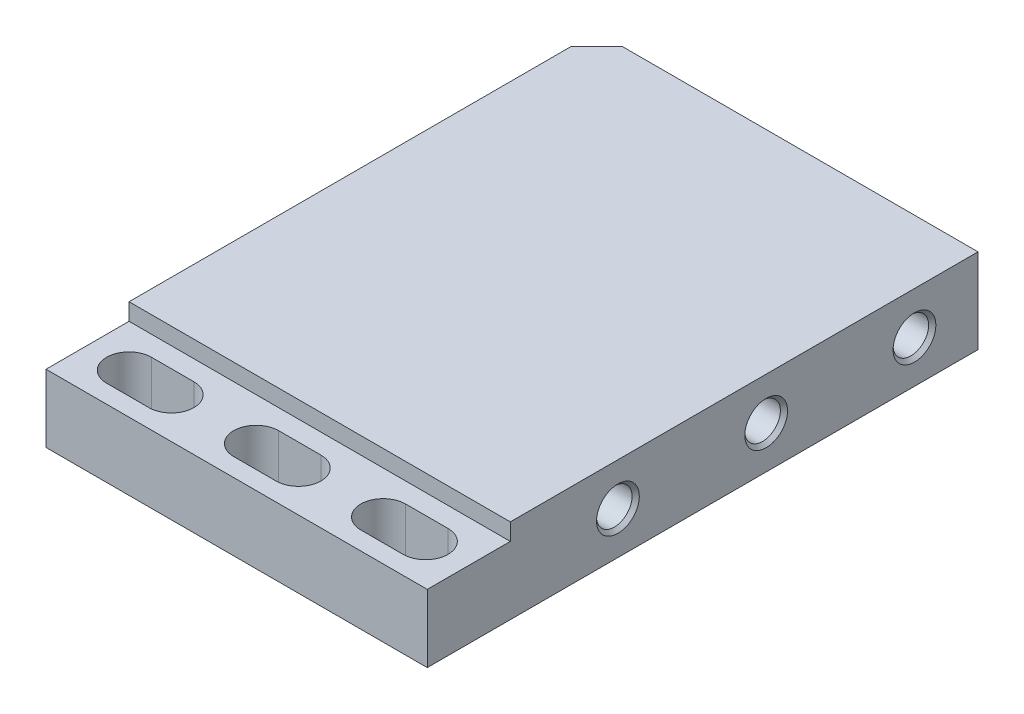
ISO-10303-21;
HEADER;
FILE_DESCRIPTION(('STEP AP214'),'2;1');
FILE_NAME('part.step','',(''),(''),'','','');
FILE_SCHEMA(('AUTOMOTIVE_DESIGN { 1 0 10303 214 1 1 1 1 }'));
ENDSEC;
DATA;
#1=APPLICATION_CONTEXT('core data for automotive mechanical design processes');
#2=APPLICATION_PROTOCOL_DEFINITION('international standard','automotive_design',2000,#1);
#3=PRODUCT_CONTEXT('',#1,'mechanical');
#4=PRODUCT('Part','Part','',(#3));
#5=PRODUCT_RELATED_PRODUCT_CATEGORY('part','',(#4));
#6=PRODUCT_DEFINITION_FORMATION('','',#4);
#7=PRODUCT_DEFINITION_CONTEXT('part definition',#1,'design');
#8=PRODUCT_DEFINITION('design','',#6,#7);
#9=PRODUCT_DEFINITION_SHAPE('','',#8);
#10=(LENGTH_UNIT() NAMED_UNIT(*) SI_UNIT(.MILLI.,.METRE.));
#11=(NAMED_UNIT(*) PLANE_ANGLE_UNIT() SI_UNIT($,.RADIAN.));
#12=(NAMED_UNIT(*) SI_UNIT($,.STERADIAN.) SOLID_ANGLE_UNIT());
#13=UNCERTAINTY_MEASURE_WITH_UNIT(LENGTH_MEASURE(1.E-05),#10,'distance_accuracy_value','');
#14=(GEOMETRIC_REPRESENTATION_CONTEXT(3) GLOBAL_UNCERTAINTY_ASSIGNED_CONTEXT((#13)) GLOBAL_UNIT_ASSIGNED_CONTEXT((#10,
#11,#12)) REPRESENTATION_CONTEXT('',''));
#15=CARTESIAN_POINT('',(0.,0.,0.));
#16=DIRECTION('',(0.,0.,1.));
#17=DIRECTION('',(1.,0.,0.));
#18=AXIS2_PLACEMENT_3D('',#15,#16,#17);
#19=CARTESIAN_POINT('',(-22.5,5.,-29.5));
#20=DIRECTION('',(0.707106781186545,0.,0.70710678118655));
#21=DIRECTION('',(0.,-1.,0.));
#22=AXIS2_PLACEMENT_3D('',#19,#20,#21);
#23=PLANE('',#22);
#24=DIRECTION('',(-0.70710678118655,0.,0.707106781186545));
#25=VECTOR('',#24,1.);
#26=CARTESIAN_POINT('',(-26.,5.,-26.));
#27=LINE('',#26,#25);
#28=CARTESIAN_POINT('',(-19.5,5.,-32.5));
#29=VERTEX_POINT('',#28);
#30=CARTESIAN_POINT('',(-22.5,5.,-29.5));
#31=VERTEX_POINT('',#30);
#32=EDGE_CURVE('E451',#29,#31,#27,.T.);
#33=ORIENTED_EDGE('',*,*,#32,.F.);
#34=DIRECTION('',(0.,1.,0.));
#35=VECTOR('',#34,1.);
#36=CARTESIAN_POINT('',(-19.5,5.,-32.5));
#37=LINE('',#36,#35);
#38=CARTESIAN_POINT('',(-19.5,-5.,-32.5));
#39=VERTEX_POINT('',#38);
#40=EDGE_CURVE('E446',#39,#29,#37,.T.);
#41=ORIENTED_EDGE('',*,*,#40,.F.);
#42=DIRECTION('',(0.70710678118655,0.,-0.707106781186545));
#43=VECTOR('',#42,1.);
#44=CARTESIAN_POINT('',(-22.5,-5.,-29.5));
#45=LINE('',#44,#43);
#46=CARTESIAN_POINT('',(-22.5,-5.,-29.5));
#47=VERTEX_POINT('',#46);
#48=EDGE_CURVE('E457',#47,#39,#45,.T.);
#49=ORIENTED_EDGE('',*,*,#48,.F.);
#50=DIRECTION('',(0.,-1.,0.));
#51=VECTOR('',#50,1.);
#52=CARTESIAN_POINT('',(-22.5,5.,-29.5));
#53=LINE('',#52,#51);
#54=EDGE_CURVE('E634',#31,#47,#53,.T.);
#55=ORIENTED_EDGE('',*,*,#54,.F.);
#56=EDGE_LOOP('',(#33,#41,#49,#55));
#57=FACE_BOUND('',#56,.T.);
#58=ADVANCED_FACE('F17',(#57),#23,.F.);
#59=CARTESIAN_POINT('',(0.,-5.,31.35));
#60=DIRECTION('',(0.,0.707106781186548,0.707106781186548));
#61=DIRECTION('',(1.,0.,0.));
#62=AXIS2_PLACEMENT_3D('',#59,#60,#61);
#63=PLANE('',#62);
#64=DIRECTION('',(0.,0.707106781186551,-0.707106781186545));
#65=VECTOR('',#64,1.);
#66=CARTESIAN_POINT('',(12.5,-5.,31.35));
#67=LINE('',#66,#65);
#68=CARTESIAN_POINT('',(12.5,-5.,31.35));
#69=VERTEX_POINT('',#68);
#70=CARTESIAN_POINT('',(12.5,-4.,30.35));
#71=VERTEX_POINT('',#70);
#72=EDGE_CURVE('E20',#69,#71,#67,.T.);
#73=ORIENTED_EDGE('',*,*,#72,.T.);
#74=DIRECTION('',(-1.,0.,0.));
#75=VECTOR('',#74,1.);
#76=CARTESIAN_POINT('',(17.5,-4.,30.35));
#77=LINE('',#76,#75);
#78=CARTESIAN_POINT('',(17.5,-4.,30.35));
#79=VERTEX_POINT('',#78);
#80=EDGE_CURVE('E339',#79,#71,#77,.T.);
#81=ORIENTED_EDGE('',*,*,#80,.F.);
#82=DIRECTION('',(0.,-0.707106781186549,0.707106781186546));
#83=VECTOR('',#82,1.);
#84=CARTESIAN_POINT('',(17.5,-4.,30.35));
#85=LINE('',#84,#83);
#86=CARTESIAN_POINT('',(17.5,-5.,31.35));
#87=VERTEX_POINT('',#86);
#88=EDGE_CURVE('E11',#79,#87,#85,.T.);
#89=ORIENTED_EDGE('',*,*,#88,.T.);
#90=DIRECTION('',(1.,0.,0.));
#91=VECTOR('',#90,1.);
#92=CARTESIAN_POINT('',(0.,-5.,31.35));
#93=LINE('',#92,#91);
#94=EDGE_CURVE('E507',#69,#87,#93,.T.);
#95=ORIENTED_EDGE('',*,*,#94,.F.);
#96=EDGE_LOOP('',(#73,#81,#89,#95));
#97=FACE_BOUND('',#96,.T.);
#98=ADVANCED_FACE('F1162',(#97),#63,.F.);
#99=CARTESIAN_POINT('',(17.5,-5.,27.7));
#100=DIRECTION('',(0.,-1.,0.));
#101=DIRECTION('',(0.,0.,-1.));
#102=AXIS2_PLACEMENT_3D('',#99,#100,#101);
#103=CONICAL_SURFACE('',#102,3.65,0.785398163397446);
#104=DIRECTION('',(0.,-0.707106781186549,-0.707106781186546));
#105=VECTOR('',#104,1.);
#106=CARTESIAN_POINT('',(17.5,-4.,25.05));
#107=LINE('',#106,#105);
#108=CARTESIAN_POINT('',(17.5,-4.,25.05));
#109=VERTEX_POINT('',#108);
#110=CARTESIAN_POINT('',(17.5,-5.,24.05));
#111=VERTEX_POINT('',#110);
#112=EDGE_CURVE('E432',#109,#111,#107,.T.);
#113=ORIENTED_EDGE('',*,*,#112,.T.);
#114=CARTESIAN_POINT('',(17.5,-5.,27.7));
#115=DIRECTION('',(0.,1.,0.));
#116=DIRECTION('',(0.,0.,1.));
#117=AXIS2_PLACEMENT_3D('',#114,#115,#116);
#118=CIRCLE('',#117,3.65);
#119=EDGE_CURVE('E511',#87,#111,#118,.T.);
#120=ORIENTED_EDGE('',*,*,#119,.F.);
#121=ORIENTED_EDGE('',*,*,#88,.F.);
#122=CARTESIAN_POINT('',(17.5,-4.,27.7));
#123=DIRECTION('',(0.,-1.,0.));
#124=DIRECTION('',(0.,0.,1.));
#125=AXIS2_PLACEMENT_3D('',#122,#123,#124);
#126=CIRCLE('',#125,2.65);
#127=EDGE_CURVE('E350',#109,#79,#126,.T.);
#128=ORIENTED_EDGE('',*,*,#127,.F.);
#129=EDGE_LOOP('',(#113,#120,#121,#128));
#130=FACE_BOUND('',#129,.T.);
#131=ADVANCED_FACE('F1158',(#130),#103,.F.);
#132=CARTESIAN_POINT('',(12.5,-5.,27.7));
#133=DIRECTION('',(0.,-1.,0.));
#134=DIRECTION('',(0.,0.,-1.));
#135=AXIS2_PLACEMENT_3D('',#132,#133,#134);
#136=CONICAL_SURFACE('',#135,3.65,0.785398163397446);
#137=DIRECTION('',(0.,0.707106781186549,0.707106781186546));
#138=VECTOR('',#137,1.);
#139=CARTESIAN_POINT('',(12.5,-5.,24.05));
#140=LINE('',#139,#138);
#141=CARTESIAN_POINT('',(12.5,-5.,24.05));
#142=VERTEX_POINT('',#141);
#143=CARTESIAN_POINT('',(12.5,-4.,25.05));
#144=VERTEX_POINT('',#143);
#145=EDGE_CURVE('E542',#142,#144,#140,.T.);
#146=ORIENTED_EDGE('',*,*,#145,.T.);
#147=CARTESIAN_POINT('',(12.5,-4.,27.7));
#148=DIRECTION('',(0.,-1.,0.));
#149=DIRECTION('',(0.,0.,1.));
#150=AXIS2_PLACEMENT_3D('',#147,#148,#149);
#151=CIRCLE('',#150,2.65);
#152=EDGE_CURVE('E338',#71,#144,#151,.T.);
#153=ORIENTED_EDGE('',*,*,#152,.F.);
#154=ORIENTED_EDGE('',*,*,#72,.F.);
#155=CARTESIAN_POINT('',(12.5,-5.,27.7));
#156=DIRECTION('',(0.,1.,0.));
#157=DIRECTION('',(0.,0.,1.));
#158=AXIS2_PLACEMENT_3D('',#155,#156,#157);
#159=CIRCLE('',#158,3.65);
#160=EDGE_CURVE('E503',#142,#69,#159,.T.);
#161=ORIENTED_EDGE('',*,*,#160,.F.);
#162=EDGE_LOOP('',(#146,#153,#154,#161));
#163=FACE_BOUND('',#162,.T.);
#164=ADVANCED_FACE('F1059',(#163),#136,.F.);
#165=CARTESIAN_POINT('',(0.,-5.,24.05));
#166=DIRECTION('',(0.,0.707106781186546,-0.707106781186549));
#167=DIRECTION('',(-1.,0.,0.));
#168=AXIS2_PLACEMENT_3D('',#165,#166,#167);
#169=PLANE('',#168);
#170=ORIENTED_EDGE('',*,*,#112,.F.);
#171=DIRECTION('',(1.,0.,0.));
#172=VECTOR('',#171,1.);
#173=CARTESIAN_POINT('',(17.5,-4.,25.05));
#174=LINE('',#173,#172);
#175=EDGE_CURVE('E374',#144,#109,#174,.T.);
#176=ORIENTED_EDGE('',*,*,#175,.F.);
#177=ORIENTED_EDGE('',*,*,#145,.F.);
#178=DIRECTION('',(-1.,0.,0.));
#179=VECTOR('',#178,1.);
#180=CARTESIAN_POINT('',(0.,-5.,24.05));
#181=LINE('',#180,#179);
#182=EDGE_CURVE('E515',#111,#142,#181,.T.);
#183=ORIENTED_EDGE('',*,*,#182,.F.);
#184=EDGE_LOOP('',(#170,#176,#177,#183));
#185=FACE_BOUND('',#184,.T.);
#186=ADVANCED_FACE('F1054',(#185),#169,.F.);
#187=CARTESIAN_POINT('',(0.,-5.,31.35));
#188=DIRECTION('',(0.,0.707106781186546,0.707106781186549));
#189=DIRECTION('',(1.,0.,0.));
#190=AXIS2_PLACEMENT_3D('',#187,#188,#189);
#191=PLANE('',#190);
#192=DIRECTION('',(0.,0.707106781186549,-0.707106781186546));
#193=VECTOR('',#192,1.);
#194=CARTESIAN_POINT('',(-2.5,-5.,31.35));
#195=LINE('',#194,#193);
#196=CARTESIAN_POINT('',(-2.5,-5.,31.35));
#197=VERTEX_POINT('',#196);
#198=CARTESIAN_POINT('',(-2.5,-4.,30.35));
#199=VERTEX_POINT('',#198);
#200=EDGE_CURVE('E416',#197,#199,#195,.T.);
#201=ORIENTED_EDGE('',*,*,#200,.T.);
#202=DIRECTION('',(-1.,0.,0.));
#203=VECTOR('',#202,1.);
#204=CARTESIAN_POINT('',(2.5,-4.,30.35));
#205=LINE('',#204,#203);
#206=CARTESIAN_POINT('',(2.5,-4.,30.35));
#207=VERTEX_POINT('',#206);
#208=EDGE_CURVE('E388',#207,#199,#205,.T.);
#209=ORIENTED_EDGE('',*,*,#208,.F.);
#210=DIRECTION('',(0.,-0.707106781186549,0.707106781186546));
#211=VECTOR('',#210,1.);
#212=CARTESIAN_POINT('',(2.5,-4.,30.35));
#213=LINE('',#212,#211);
#214=CARTESIAN_POINT('',(2.5,-5.,31.35));
#215=VERTEX_POINT('',#214);
#216=EDGE_CURVE('E424',#207,#215,#213,.T.);
#217=ORIENTED_EDGE('',*,*,#216,.T.);
#218=DIRECTION('',(1.,0.,0.));
#219=VECTOR('',#218,1.);
#220=CARTESIAN_POINT('',(0.,-5.,31.35));
#221=LINE('',#220,#219);
#222=EDGE_CURVE('E487',#197,#215,#221,.T.);
#223=ORIENTED_EDGE('',*,*,#222,.F.);
#224=EDGE_LOOP('',(#201,#209,#217,#223));
#225=FACE_BOUND('',#224,.T.);
#226=ADVANCED_FACE('F1058',(#225),#191,.F.);
#227=CARTESIAN_POINT('',(2.5,-5.,27.7));
#228=DIRECTION('',(0.,-1.,0.));
#229=DIRECTION('',(0.,0.,-1.));
#230=AXIS2_PLACEMENT_3D('',#227,#228,#229);
#231=CONICAL_SURFACE('',#230,3.65,0.785398163397446);
#232=DIRECTION('',(0.,-0.70710678118655,-0.707106781186545));
#233=VECTOR('',#232,1.);
#234=CARTESIAN_POINT('',(2.5,-4.,25.05));
#235=LINE('',#234,#233);
#236=CARTESIAN_POINT('',(2.5,-4.,25.05));
#237=VERTEX_POINT('',#236);
#238=CARTESIAN_POINT('',(2.5,-5.,24.05));
#239=VERTEX_POINT('',#238);
#240=EDGE_CURVE('E361',#237,#239,#235,.T.);
#241=ORIENTED_EDGE('',*,*,#240,.T.);
#242=CARTESIAN_POINT('',(2.5,-5.,27.7));
#243=DIRECTION('',(0.,1.,0.));
#244=DIRECTION('',(0.,0.,1.));
#245=AXIS2_PLACEMENT_3D('',#242,#243,#244);
#246=CIRCLE('',#245,3.65);
#247=EDGE_CURVE('E491',#215,#239,#246,.T.);
#248=ORIENTED_EDGE('',*,*,#247,.F.);
#249=ORIENTED_EDGE('',*,*,#216,.F.);
#250=CARTESIAN_POINT('',(2.5,-4.,27.7));
#251=DIRECTION('',(0.,-1.,0.));
#252=DIRECTION('',(0.,0.,1.));
#253=AXIS2_PLACEMENT_3D('',#250,#251,#252);
#254=CIRCLE('',#253,2.65);
#255=EDGE_CURVE('E381',#237,#207,#254,.T.);
#256=ORIENTED_EDGE('',*,*,#255,.F.);
#257=EDGE_LOOP('',(#241,#248,#249,#256));
#258=FACE_BOUND('',#257,.T.);
#259=ADVANCED_FACE('F1144',(#258),#231,.F.);
#260=CARTESIAN_POINT('',(-2.5,-5.,27.7));
#261=DIRECTION('',(0.,-1.,0.));
#262=DIRECTION('',(0.,0.,-1.));
#263=AXIS2_PLACEMENT_3D('',#260,#261,#262);
#264=CONICAL_SURFACE('',#263,3.65,0.785398163397445);
#265=DIRECTION('',(0.,0.70710678118655,0.707106781186545));
#266=VECTOR('',#265,1.);
#267=CARTESIAN_POINT('',(-2.5,-5.,24.05));
#268=LINE('',#267,#266);
#269=CARTESIAN_POINT('',(-2.5,-5.,24.05));
#270=VERTEX_POINT('',#269);
#271=CARTESIAN_POINT('',(-2.5,-4.,25.05));
#272=VERTEX_POINT('',#271);
#273=EDGE_CURVE('E414',#270,#272,#268,.T.);
#274=ORIENTED_EDGE('',*,*,#273,.T.);
#275=CARTESIAN_POINT('',(-2.5,-4.,27.7));
#276=DIRECTION('',(0.,-1.,0.));
#277=DIRECTION('',(0.,0.,1.));
#278=AXIS2_PLACEMENT_3D('',#275,#276,#277);
#279=CIRCLE('',#278,2.65);
#280=EDGE_CURVE('E325',#199,#272,#279,.T.);
#281=ORIENTED_EDGE('',*,*,#280,.F.);
#282=ORIENTED_EDGE('',*,*,#200,.F.);
#283=CARTESIAN_POINT('',(-2.5,-5.,27.7));
#284=DIRECTION('',(0.,1.,0.));
#285=DIRECTION('',(0.,0.,1.));
#286=AXIS2_PLACEMENT_3D('',#283,#284,#285);
#287=CIRCLE('',#286,3.65);
#288=EDGE_CURVE('E483',#270,#197,#287,.T.);
#289=ORIENTED_EDGE('',*,*,#288,.F.);
#290=EDGE_LOOP('',(#274,#281,#282,#289));
#291=FACE_BOUND('',#290,.T.);
#292=ADVANCED_FACE('F1324',(#291),#264,.F.);
#293=CARTESIAN_POINT('',(0.,-5.,24.05));
#294=DIRECTION('',(0.,0.707106781186545,-0.70710678118655));
#295=DIRECTION('',(-1.,0.,0.));
#296=AXIS2_PLACEMENT_3D('',#293,#294,#295);
#297=PLANE('',#296);
#298=ORIENTED_EDGE('',*,*,#240,.F.);
#299=DIRECTION('',(1.,0.,0.));
#300=VECTOR('',#299,1.);
#301=CARTESIAN_POINT('',(2.5,-4.,25.05));
#302=LINE('',#301,#300);
#303=EDGE_CURVE('E363',#272,#237,#302,.T.);
#304=ORIENTED_EDGE('',*,*,#303,.F.);
#305=ORIENTED_EDGE('',*,*,#273,.F.);
#306=DIRECTION('',(-1.,0.,0.));
#307=VECTOR('',#306,1.);
#308=CARTESIAN_POINT('',(0.,-5.,24.05));
#309=LINE('',#308,#307);
#310=EDGE_CURVE('E499',#239,#270,#309,.T.);
#311=ORIENTED_EDGE('',*,*,#310,.F.);
#312=EDGE_LOOP('',(#298,#304,#305,#311));
#313=FACE_BOUND('',#312,.T.);
#314=ADVANCED_FACE('F1315',(#313),#297,.F.);
#315=CARTESIAN_POINT('',(0.,-5.,31.35));
#316=DIRECTION('',(0.,0.707106781186545,0.70710678118655));
#317=DIRECTION('',(1.,0.,0.));
#318=AXIS2_PLACEMENT_3D('',#315,#316,#317);
#319=PLANE('',#318);
#320=DIRECTION('',(0.,0.70710678118655,-0.707106781186545));
#321=VECTOR('',#320,1.);
#322=CARTESIAN_POINT('',(-17.5,-5.,31.35));
#323=LINE('',#322,#321);
#324=CARTESIAN_POINT('',(-17.5,-5.,31.35));
#325=VERTEX_POINT('',#324);
#326=CARTESIAN_POINT('',(-17.5,-4.,30.35));
#327=VERTEX_POINT('',#326);
#328=EDGE_CURVE('E362',#325,#327,#323,.T.);
#329=ORIENTED_EDGE('',*,*,#328,.T.);
#330=DIRECTION('',(-1.,0.,0.));
#331=VECTOR('',#330,1.);
#332=CARTESIAN_POINT('',(-17.5,-4.,30.35));
#333=LINE('',#332,#331);
#334=CARTESIAN_POINT('',(-12.5,-4.,30.35));
#335=VERTEX_POINT('',#334);
#336=EDGE_CURVE('E404',#335,#327,#333,.T.);
#337=ORIENTED_EDGE('',*,*,#336,.F.);
#338=DIRECTION('',(0.,-0.70710678118655,0.707106781186545));
#339=VECTOR('',#338,1.);
#340=CARTESIAN_POINT('',(-12.5,-4.,30.35));
#341=LINE('',#340,#339);
#342=CARTESIAN_POINT('',(-12.5,-5.,31.35));
#343=VERTEX_POINT('',#342);
#344=EDGE_CURVE('E358',#335,#343,#341,.T.);
#345=ORIENTED_EDGE('',*,*,#344,.T.);
#346=DIRECTION('',(1.,0.,0.));
#347=VECTOR('',#346,1.);
#348=CARTESIAN_POINT('',(0.,-5.,31.35));
#349=LINE('',#348,#347);
#350=EDGE_CURVE('E468',#325,#343,#349,.T.);
#351=ORIENTED_EDGE('',*,*,#350,.F.);
#352=EDGE_LOOP('',(#329,#337,#345,#351));
#353=FACE_BOUND('',#352,.T.);
#354=ADVANCED_FACE('F1306',(#353),#319,.F.);
#355=CARTESIAN_POINT('',(-12.5,-5.,27.7));
#356=DIRECTION('',(0.,-1.,0.));
#357=DIRECTION('',(0.,0.,-1.));
#358=AXIS2_PLACEMENT_3D('',#355,#356,#357);
#359=CONICAL_SURFACE('',#358,3.65,0.785398163397445);
#360=DIRECTION('',(0.,-0.70710678118655,-0.707106781186545));
#361=VECTOR('',#360,1.);
#362=CARTESIAN_POINT('',(-12.5,-4.,25.05));
#363=LINE('',#362,#361);
#364=CARTESIAN_POINT('',(-12.5,-4.,25.05));
#365=VERTEX_POINT('',#364);
#366=CARTESIAN_POINT('',(-12.5,-5.,24.05));
#367=VERTEX_POINT('',#366);
#368=EDGE_CURVE('E405',#365,#367,#363,.T.);
#369=ORIENTED_EDGE('',*,*,#368,.T.);
#370=CARTESIAN_POINT('',(-12.5,-5.,27.7));
#371=DIRECTION('',(0.,1.,0.));
#372=DIRECTION('',(0.,0.,1.));
#373=AXIS2_PLACEMENT_3D('',#370,#371,#372);
#374=CIRCLE('',#373,3.65);
#375=EDGE_CURVE('E478',#343,#367,#374,.T.);
#376=ORIENTED_EDGE('',*,*,#375,.F.);
#377=ORIENTED_EDGE('',*,*,#344,.F.);
#378=CARTESIAN_POINT('',(-12.5,-4.,27.7));
#379=DIRECTION('',(0.,-1.,0.));
#380=DIRECTION('',(0.,0.,1.));
#381=AXIS2_PLACEMENT_3D('',#378,#379,#380);
#382=CIRCLE('',#381,2.65);
#383=EDGE_CURVE('E290',#365,#335,#382,.T.);
#384=ORIENTED_EDGE('',*,*,#383,.F.);
#385=EDGE_LOOP('',(#369,#376,#377,#384));
#386=FACE_BOUND('',#385,.T.);
#387=ADVANCED_FACE('F1297',(#386),#359,.F.);
#388=CARTESIAN_POINT('',(-17.5,-5.,27.7));
#389=DIRECTION('',(0.,-1.,0.));
#390=DIRECTION('',(0.,0.,-1.));
#391=AXIS2_PLACEMENT_3D('',#388,#389,#390);
#392=CONICAL_SURFACE('',#391,3.65,0.785398163397445);
#393=DIRECTION('',(0.,0.70710678118655,0.707106781186545));
#394=VECTOR('',#393,1.);
#395=CARTESIAN_POINT('',(-17.5,-5.,24.05));
#396=LINE('',#395,#394);
#397=CARTESIAN_POINT('',(-17.5,-5.,24.05));
#398=VERTEX_POINT('',#397);
#399=CARTESIAN_POINT('',(-17.5,-4.,25.05));
#400=VERTEX_POINT('',#399);
#401=EDGE_CURVE('E408',#398,#400,#396,.T.);
#402=ORIENTED_EDGE('',*,*,#401,.T.);
#403=CARTESIAN_POINT('',(-17.5,-4.,27.7));
#404=DIRECTION('',(0.,-1.,0.));
#405=DIRECTION('',(0.,0.,1.));
#406=AXIS2_PLACEMENT_3D('',#403,#404,#405);
#407=CIRCLE('',#406,2.65);
#408=EDGE_CURVE('E319',#327,#400,#407,.T.);
#409=ORIENTED_EDGE('',*,*,#408,.F.);
#410=ORIENTED_EDGE('',*,*,#328,.F.);
#411=CARTESIAN_POINT('',(-17.5,-5.,27.7));
#412=DIRECTION('',(0.,1.,0.));
#413=DIRECTION('',(0.,0.,1.));
#414=AXIS2_PLACEMENT_3D('',#411,#412,#413);
#415=CIRCLE('',#414,3.65);
#416=EDGE_CURVE('E459',#398,#325,#415,.T.);
#417=ORIENTED_EDGE('',*,*,#416,.F.);
#418=EDGE_LOOP('',(#402,#409,#410,#417));
#419=FACE_BOUND('',#418,.T.);
#420=ADVANCED_FACE('F1288',(#419),#392,.F.);
#421=CARTESIAN_POINT('',(0.,-5.,24.05));
#422=DIRECTION('',(0.,0.707106781186545,-0.70710678118655));
#423=DIRECTION('',(-1.,0.,0.));
#424=AXIS2_PLACEMENT_3D('',#421,#422,#423);
#425=PLANE('',#424);
#426=ORIENTED_EDGE('',*,*,#368,.F.);
#427=DIRECTION('',(1.,0.,0.));
#428=VECTOR('',#427,1.);
#429=CARTESIAN_POINT('',(-17.5,-4.,25.05));
#430=LINE('',#429,#428);
#431=EDGE_CURVE('E286',#400,#365,#430,.T.);
#432=ORIENTED_EDGE('',*,*,#431,.F.);
#433=ORIENTED_EDGE('',*,*,#401,.F.);
#434=DIRECTION('',(-1.,0.,0.));
#435=VECTOR('',#434,1.);
#436=CARTESIAN_POINT('',(0.,-5.,24.05));
#437=LINE('',#436,#435);
#438=EDGE_CURVE('E479',#367,#398,#437,.T.);
#439=ORIENTED_EDGE('',*,*,#438,.F.);
#440=EDGE_LOOP('',(#426,#432,#433,#439));
#441=FACE_BOUND('',#440,.T.);
#442=ADVANCED_FACE('F1279',(#441),#425,.F.);
#443=CARTESIAN_POINT('',(-17.5,-5.,30.35));
#444=DIRECTION('',(0.,0.,1.));
#445=DIRECTION('',(1.,0.,0.));
#446=AXIS2_PLACEMENT_3D('',#443,#444,#445);
#447=PLANE('',#446);
#448=DIRECTION('',(0.,1.,0.));
#449=VECTOR('',#448,1.);
#450=CARTESIAN_POINT('',(-12.5,-5.,30.35));
#451=LINE('',#450,#449);
#452=CARTESIAN_POINT('',(-12.5,3.,30.35));
#453=VERTEX_POINT('',#452);
#454=EDGE_CURVE('E296',#335,#453,#451,.T.);
#455=ORIENTED_EDGE('',*,*,#454,.F.);
#456=ORIENTED_EDGE('',*,*,#336,.T.);
#457=DIRECTION('',(0.,1.,0.));
#458=VECTOR('',#457,1.);
#459=CARTESIAN_POINT('',(-17.5,-5.,30.35));
#460=LINE('',#459,#458);
#461=CARTESIAN_POINT('',(-17.5,3.,30.35));
#462=VERTEX_POINT('',#461);
#463=EDGE_CURVE('E367',#327,#462,#460,.T.);
#464=ORIENTED_EDGE('',*,*,#463,.T.);
#465=DIRECTION('',(1.,0.,0.));
#466=VECTOR('',#465,1.);
#467=CARTESIAN_POINT('',(-17.5,3.,30.35));
#468=LINE('',#467,#466);
#469=EDGE_CURVE('E313',#462,#453,#468,.T.);
#470=ORIENTED_EDGE('',*,*,#469,.T.);
#471=EDGE_LOOP('',(#455,#456,#464,#470));
#472=FACE_BOUND('',#471,.T.);
#473=ADVANCED_FACE('F1271',(#472),#447,.F.);
#474=CARTESIAN_POINT('',(-12.5,-5.,27.7));
#475=DIRECTION('',(0.,1.,0.));
#476=DIRECTION('',(0.,0.,1.));
#477=AXIS2_PLACEMENT_3D('',#474,#475,#476);
#478=CYLINDRICAL_SURFACE('',#477,2.65);
#479=DIRECTION('',(0.,1.,0.));
#480=VECTOR('',#479,1.);
#481=CARTESIAN_POINT('',(-12.5,-5.,25.05));
#482=LINE('',#481,#480);
#483=CARTESIAN_POINT('',(-12.5,3.,25.05));
#484=VERTEX_POINT('',#483);
#485=EDGE_CURVE('E278',#365,#484,#482,.T.);
#486=ORIENTED_EDGE('',*,*,#485,.F.);
#487=ORIENTED_EDGE('',*,*,#383,.T.);
#488=ORIENTED_EDGE('',*,*,#454,.T.);
#489=CARTESIAN_POINT('',(-12.5,3.,27.7));
#490=DIRECTION('',(0.,1.,0.));
#491=DIRECTION('',(0.,0.,1.));
#492=AXIS2_PLACEMENT_3D('',#489,#490,#491);
#493=CIRCLE('',#492,2.65);
#494=EDGE_CURVE('E293',#453,#484,#493,.T.);
#495=ORIENTED_EDGE('',*,*,#494,.T.);
#496=EDGE_LOOP('',(#486,#487,#488,#495));
#497=FACE_BOUND('',#496,.T.);
#498=ADVANCED_FACE('F294',(#497),#478,.F.);
#499=CARTESIAN_POINT('',(-17.5,-5.,25.05));
#500=DIRECTION('',(0.,0.,-1.));
#501=DIRECTION('',(0.,-1.,0.));
#502=AXIS2_PLACEMENT_3D('',#499,#500,#501);
#503=PLANE('',#502);
#504=DIRECTION('',(0.,1.,0.));
#505=VECTOR('',#504,1.);
#506=CARTESIAN_POINT('',(-17.5,-5.,25.05));
#507=LINE('',#506,#505);
#508=CARTESIAN_POINT('',(-17.5,3.,25.05));
#509=VERTEX_POINT('',#508);
#510=EDGE_CURVE('E317',#400,#509,#507,.T.);
#511=ORIENTED_EDGE('',*,*,#510,.F.);
#512=ORIENTED_EDGE('',*,*,#431,.T.);
#513=ORIENTED_EDGE('',*,*,#485,.T.);
#514=DIRECTION('',(-1.,0.,0.));
#515=VECTOR('',#514,1.);
#516=CARTESIAN_POINT('',(-17.5,3.,25.05));
#517=LINE('',#516,#515);
#518=EDGE_CURVE('E283',#484,#509,#517,.T.);
#519=ORIENTED_EDGE('',*,*,#518,.T.);
#520=EDGE_LOOP('',(#511,#512,#513,#519));
#521=FACE_BOUND('',#520,.T.);
#522=ADVANCED_FACE('F281',(#521),#503,.F.);
#523=CARTESIAN_POINT('',(-17.5,-5.,27.7));
#524=DIRECTION('',(0.,1.,0.));
#525=DIRECTION('',(0.,0.,1.));
#526=AXIS2_PLACEMENT_3D('',#523,#524,#525);
#527=CYLINDRICAL_SURFACE('',#526,2.65);
#528=ORIENTED_EDGE('',*,*,#463,.F.);
#529=ORIENTED_EDGE('',*,*,#408,.T.);
#530=ORIENTED_EDGE('',*,*,#510,.T.);
#531=CARTESIAN_POINT('',(-17.5,3.,27.7));
#532=DIRECTION('',(0.,1.,0.));
#533=DIRECTION('',(0.,0.,1.));
#534=AXIS2_PLACEMENT_3D('',#531,#532,#533);
#535=CIRCLE('',#534,2.65);
#536=EDGE_CURVE('E306',#509,#462,#535,.T.);
#537=ORIENTED_EDGE('',*,*,#536,.T.);
#538=EDGE_LOOP('',(#528,#529,#530,#537));
#539=FACE_BOUND('',#538,.T.);
#540=ADVANCED_FACE('F1247',(#539),#527,.F.);
#541=CARTESIAN_POINT('',(2.5,-5.,25.05));
#542=DIRECTION('',(0.,0.,-1.));
#543=DIRECTION('',(0.,-1.,0.));
#544=AXIS2_PLACEMENT_3D('',#541,#542,#543);
#545=PLANE('',#544);
#546=DIRECTION('',(0.,1.,0.));
#547=VECTOR('',#546,1.);
#548=CARTESIAN_POINT('',(-2.5,-5.,25.05));
#549=LINE('',#548,#547);
#550=CARTESIAN_POINT('',(-2.5,3.,25.05));
#551=VERTEX_POINT('',#550);
#552=EDGE_CURVE('E329',#272,#551,#549,.T.);
#553=ORIENTED_EDGE('',*,*,#552,.F.);
#554=ORIENTED_EDGE('',*,*,#303,.T.);
#555=DIRECTION('',(0.,1.,0.));
#556=VECTOR('',#555,1.);
#557=CARTESIAN_POINT('',(2.5,-5.,25.05));
#558=LINE('',#557,#556);
#559=CARTESIAN_POINT('',(2.5,3.,25.05));
#560=VERTEX_POINT('',#559);
#561=EDGE_CURVE('E378',#237,#560,#558,.T.);
#562=ORIENTED_EDGE('',*,*,#561,.T.);
#563=DIRECTION('',(-1.,0.,0.));
#564=VECTOR('',#563,1.);
#565=CARTESIAN_POINT('',(2.5,3.,25.05));
#566=LINE('',#565,#564);
#567=EDGE_CURVE('E301',#560,#551,#566,.T.);
#568=ORIENTED_EDGE('',*,*,#567,.T.);
#569=EDGE_LOOP('',(#553,#554,#562,#568));
#570=FACE_BOUND('',#569,.T.);
#571=ADVANCED_FACE('F1238',(#570),#545,.F.);
#572=CARTESIAN_POINT('',(-2.5,-5.,27.7));
#573=DIRECTION('',(0.,1.,0.));
#574=DIRECTION('',(0.,0.,1.));
#575=AXIS2_PLACEMENT_3D('',#572,#573,#574);
#576=CYLINDRICAL_SURFACE('',#575,2.65);
#577=DIRECTION('',(0.,1.,0.));
#578=VECTOR('',#577,1.);
#579=CARTESIAN_POINT('',(-2.5,-5.,30.35));
#580=LINE('',#579,#578);
#581=CARTESIAN_POINT('',(-2.5,3.,30.35));
#582=VERTEX_POINT('',#581);
#583=EDGE_CURVE('E330',#199,#582,#580,.T.);
#584=ORIENTED_EDGE('',*,*,#583,.F.);
#585=ORIENTED_EDGE('',*,*,#280,.T.);
#586=ORIENTED_EDGE('',*,*,#552,.T.);
#587=CARTESIAN_POINT('',(-2.5,3.,27.7));
#588=DIRECTION('',(0.,1.,0.));
#589=DIRECTION('',(0.,0.,1.));
#590=AXIS2_PLACEMENT_3D('',#587,#588,#589);
#591=CIRCLE('',#590,2.65);
#592=EDGE_CURVE('E519',#551,#582,#591,.T.);
#593=ORIENTED_EDGE('',*,*,#592,.T.);
#594=EDGE_LOOP('',(#584,#585,#586,#593));
#595=FACE_BOUND('',#594,.T.);
#596=ADVANCED_FACE('F1229',(#595),#576,.F.);
#597=CARTESIAN_POINT('',(2.5,-5.,30.35));
#598=DIRECTION('',(0.,0.,1.));
#599=DIRECTION('',(1.,0.,0.));
#600=AXIS2_PLACEMENT_3D('',#597,#598,#599);
#601=PLANE('',#600);
#602=DIRECTION('',(0.,1.,0.));
#603=VECTOR('',#602,1.);
#604=CARTESIAN_POINT('',(2.5,-5.,30.35));
#605=LINE('',#604,#603);
#606=CARTESIAN_POINT('',(2.5,3.,30.35));
#607=VERTEX_POINT('',#606);
#608=EDGE_CURVE('E385',#207,#607,#605,.T.);
#609=ORIENTED_EDGE('',*,*,#608,.F.);
#610=ORIENTED_EDGE('',*,*,#208,.T.);
#611=ORIENTED_EDGE('',*,*,#583,.T.);
#612=DIRECTION('',(1.,0.,0.));
#613=VECTOR('',#612,1.);
#614=CARTESIAN_POINT('',(2.5,3.,30.35));
#615=LINE('',#614,#613);
#616=EDGE_CURVE('E334',#582,#607,#615,.T.);
#617=ORIENTED_EDGE('',*,*,#616,.T.);
#618=EDGE_LOOP('',(#609,#610,#611,#617));
#619=FACE_BOUND('',#618,.T.);
#620=ADVANCED_FACE('F1220',(#619),#601,.F.);
#621=CARTESIAN_POINT('',(2.5,-5.,27.7));
#622=DIRECTION('',(0.,1.,0.));
#623=DIRECTION('',(0.,0.,1.));
#624=AXIS2_PLACEMENT_3D('',#621,#622,#623);
#625=CYLINDRICAL_SURFACE('',#624,2.65);
#626=ORIENTED_EDGE('',*,*,#561,.F.);
#627=ORIENTED_EDGE('',*,*,#255,.T.);
#628=ORIENTED_EDGE('',*,*,#608,.T.);
#629=CARTESIAN_POINT('',(2.5,3.,27.7));
#630=DIRECTION('',(0.,1.,0.));
#631=DIRECTION('',(0.,0.,1.));
#632=AXIS2_PLACEMENT_3D('',#629,#630,#631);
#633=CIRCLE('',#632,2.65);
#634=EDGE_CURVE('E324',#607,#560,#633,.T.);
#635=ORIENTED_EDGE('',*,*,#634,.T.);
#636=EDGE_LOOP('',(#626,#627,#628,#635));
#637=FACE_BOUND('',#636,.T.);
#638=ADVANCED_FACE('F1211',(#637),#625,.F.);
#639=CARTESIAN_POINT('',(17.5,-5.,25.05));
#640=DIRECTION('',(0.,0.,-1.));
#641=DIRECTION('',(-1.,0.,0.));
#642=AXIS2_PLACEMENT_3D('',#639,#640,#641);
#643=PLANE('',#642);
#644=DIRECTION('',(0.,1.,0.));
#645=VECTOR('',#644,1.);
#646=CARTESIAN_POINT('',(12.5,-5.,25.05));
#647=LINE('',#646,#645);
#648=CARTESIAN_POINT('',(12.5,3.,25.05));
#649=VERTEX_POINT('',#648);
#650=EDGE_CURVE('E371',#144,#649,#647,.T.);
#651=ORIENTED_EDGE('',*,*,#650,.F.);
#652=ORIENTED_EDGE('',*,*,#175,.T.);
#653=DIRECTION('',(0.,1.,0.));
#654=VECTOR('',#653,1.);
#655=CARTESIAN_POINT('',(17.5,-5.,25.05));
#656=LINE('',#655,#654);
#657=CARTESIAN_POINT('',(17.5,3.,25.05));
#658=VERTEX_POINT('',#657);
#659=EDGE_CURVE('E349',#109,#658,#656,.T.);
#660=ORIENTED_EDGE('',*,*,#659,.T.);
#661=DIRECTION('',(-1.,0.,0.));
#662=VECTOR('',#661,1.);
#663=CARTESIAN_POINT('',(17.5,3.,25.05));
#664=LINE('',#663,#662);
#665=EDGE_CURVE('E494',#658,#649,#664,.T.);
#666=ORIENTED_EDGE('',*,*,#665,.T.);
#667=EDGE_LOOP('',(#651,#652,#660,#666));
#668=FACE_BOUND('',#667,.T.);
#669=ADVANCED_FACE('F1202',(#668),#643,.F.);
#670=CARTESIAN_POINT('',(12.5,-5.,27.7));
#671=DIRECTION('',(0.,1.,0.));
#672=DIRECTION('',(0.,0.,1.));
#673=AXIS2_PLACEMENT_3D('',#670,#671,#672);
#674=CYLINDRICAL_SURFACE('',#673,2.65);
#675=DIRECTION('',(0.,1.,0.));
#676=VECTOR('',#675,1.);
#677=CARTESIAN_POINT('',(12.5,-5.,30.35));
#678=LINE('',#677,#676);
#679=CARTESIAN_POINT('',(12.5,3.,30.35));
#680=VERTEX_POINT('',#679);
#681=EDGE_CURVE('E335',#71,#680,#678,.T.);
#682=ORIENTED_EDGE('',*,*,#681,.F.);
#683=ORIENTED_EDGE('',*,*,#152,.T.);
#684=ORIENTED_EDGE('',*,*,#650,.T.);
#685=CARTESIAN_POINT('',(12.5,3.,27.7));
#686=DIRECTION('',(0.,1.,0.));
#687=DIRECTION('',(0.,0.,1.));
#688=AXIS2_PLACEMENT_3D('',#685,#686,#687);
#689=CIRCLE('',#688,2.65);
#690=EDGE_CURVE('E344',#649,#680,#689,.T.);
#691=ORIENTED_EDGE('',*,*,#690,.T.);
#692=EDGE_LOOP('',(#682,#683,#684,#691));
#693=FACE_BOUND('',#692,.T.);
#694=ADVANCED_FACE('F1070',(#693),#674,.F.);
#695=CARTESIAN_POINT('',(17.5,-5.,30.35));
#696=DIRECTION('',(0.,0.,1.));
#697=DIRECTION('',(1.,0.,0.));
#698=AXIS2_PLACEMENT_3D('',#695,#696,#697);
#699=PLANE('',#698);
#700=DIRECTION('',(0.,1.,0.));
#701=VECTOR('',#700,1.);
#702=CARTESIAN_POINT('',(17.5,-5.,30.35));
#703=LINE('',#702,#701);
#704=CARTESIAN_POINT('',(17.5,3.,30.35));
#705=VERTEX_POINT('',#704);
#706=EDGE_CURVE('E354',#79,#705,#703,.T.);
#707=ORIENTED_EDGE('',*,*,#706,.F.);
#708=ORIENTED_EDGE('',*,*,#80,.T.);
#709=ORIENTED_EDGE('',*,*,#681,.T.);
#710=DIRECTION('',(1.,0.,0.));
#711=VECTOR('',#710,1.);
#712=CARTESIAN_POINT('',(17.5,3.,30.35));
#713=LINE('',#712,#711);
#714=EDGE_CURVE('E340',#680,#705,#713,.T.);
#715=ORIENTED_EDGE('',*,*,#714,.T.);
#716=EDGE_LOOP('',(#707,#708,#709,#715));
#717=FACE_BOUND('',#716,.T.);
#718=ADVANCED_FACE('F1065',(#717),#699,.F.);
#719=CARTESIAN_POINT('',(17.5,-5.,27.7));
#720=DIRECTION('',(0.,1.,0.));
#721=DIRECTION('',(0.,0.,1.));
#722=AXIS2_PLACEMENT_3D('',#719,#720,#721);
#723=CYLINDRICAL_SURFACE('',#722,2.65);
#724=ORIENTED_EDGE('',*,*,#659,.F.);
#725=ORIENTED_EDGE('',*,*,#127,.T.);
#726=ORIENTED_EDGE('',*,*,#706,.T.);
#727=CARTESIAN_POINT('',(17.5,3.,27.7));
#728=DIRECTION('',(0.,1.,0.));
#729=DIRECTION('',(0.,0.,1.));
#730=AXIS2_PLACEMENT_3D('',#727,#728,#729);
#731=CIRCLE('',#730,2.65);
#732=EDGE_CURVE('E345',#705,#658,#731,.T.);
#733=ORIENTED_EDGE('',*,*,#732,.T.);
#734=EDGE_LOOP('',(#724,#725,#726,#733));
#735=FACE_BOUND('',#734,.T.);
#736=ADVANCED_FACE('F1069',(#735),#723,.F.);
#737=CARTESIAN_POINT('',(0.,3.,0.));
#738=DIRECTION('',(0.,-1.,0.));
#739=DIRECTION('',(0.,0.,-1.));
#740=AXIS2_PLACEMENT_3D('',#737,#738,#739);
#741=PLANE('',#740);
#742=ORIENTED_EDGE('',*,*,#665,.F.);
#743=ORIENTED_EDGE('',*,*,#732,.F.);
#744=ORIENTED_EDGE('',*,*,#714,.F.);
#745=ORIENTED_EDGE('',*,*,#690,.F.);
#746=EDGE_LOOP('',(#742,#743,#744,#745));
#747=FACE_BOUND('',#746,.T.);
#748=ORIENTED_EDGE('',*,*,#567,.F.);
#749=ORIENTED_EDGE('',*,*,#634,.F.);
#750=ORIENTED_EDGE('',*,*,#616,.F.);
#751=ORIENTED_EDGE('',*,*,#592,.F.);
#752=EDGE_LOOP('',(#748,#749,#750,#751));
#753=FACE_BOUND('',#752,.T.);
#754=ORIENTED_EDGE('',*,*,#469,.F.);
#755=ORIENTED_EDGE('',*,*,#536,.F.);
#756=ORIENTED_EDGE('',*,*,#518,.F.);
#757=ORIENTED_EDGE('',*,*,#494,.F.);
#758=EDGE_LOOP('',(#754,#755,#756,#757));
#759=FACE_BOUND('',#758,.T.);
#760=DIRECTION('',(0.,0.,1.));
#761=VECTOR('',#760,1.);
#762=CARTESIAN_POINT('',(-22.5,3.,32.5));
#763=LINE('',#762,#761);
#764=CARTESIAN_POINT('',(-22.5,3.,22.7));
#765=VERTEX_POINT('',#764);
#766=CARTESIAN_POINT('',(-22.5,3.,32.5));
#767=VERTEX_POINT('',#766);
#768=EDGE_CURVE('E608',#765,#767,#763,.T.);
#769=ORIENTED_EDGE('',*,*,#768,.T.);
#770=DIRECTION('',(1.,0.,0.));
#771=VECTOR('',#770,1.);
#772=CARTESIAN_POINT('',(-22.5,3.,32.5));
#773=LINE('',#772,#771);
#774=CARTESIAN_POINT('',(22.5,3.,32.5));
#775=VERTEX_POINT('',#774);
#776=EDGE_CURVE('E567',#767,#775,#773,.T.);
#777=ORIENTED_EDGE('',*,*,#776,.T.);
#778=DIRECTION('',(0.,0.,-1.));
#779=VECTOR('',#778,1.);
#780=CARTESIAN_POINT('',(22.5,3.,32.5));
#781=LINE('',#780,#779);
#782=CARTESIAN_POINT('',(22.5,3.,22.7));
#783=VERTEX_POINT('',#782);
#784=EDGE_CURVE('E580',#775,#783,#781,.T.);
#785=ORIENTED_EDGE('',*,*,#784,.T.);
#786=DIRECTION('',(-1.,0.,0.));
#787=VECTOR('',#786,1.);
#788=CARTESIAN_POINT('',(-22.5,3.,22.7));
#789=LINE('',#788,#787);
#790=EDGE_CURVE('E539',#783,#765,#789,.T.);
#791=ORIENTED_EDGE('',*,*,#790,.T.);
#792=EDGE_LOOP('',(#769,#777,#785,#791));
#793=FACE_BOUND('',#792,.T.);
#794=ADVANCED_FACE('F303',(#747,#753,#759,#793),#741,.F.);
#795=CARTESIAN_POINT('',(-22.5,3.,22.7));
#796=DIRECTION('',(0.,0.,-1.));
#797=DIRECTION('',(0.,-1.,0.));
#798=AXIS2_PLACEMENT_3D('',#795,#796,#797);
#799=PLANE('',#798);
#800=DIRECTION('',(-1.,0.,0.));
#801=VECTOR('',#800,1.);
#802=CARTESIAN_POINT('',(-22.5,5.,22.7));
#803=LINE('',#802,#801);
#804=CARTESIAN_POINT('',(22.5,5.,22.7));
#805=VERTEX_POINT('',#804);
#806=CARTESIAN_POINT('',(-22.5,5.,22.7));
#807=VERTEX_POINT('',#806);
#808=EDGE_CURVE('E454',#805,#807,#803,.T.);
#809=ORIENTED_EDGE('',*,*,#808,.T.);
#810=DIRECTION('',(0.,1.,0.));
#811=VECTOR('',#810,1.);
#812=CARTESIAN_POINT('',(-22.5,3.,22.7));
#813=LINE('',#812,#811);
#814=EDGE_CURVE('E561',#765,#807,#813,.T.);
#815=ORIENTED_EDGE('',*,*,#814,.F.);
#816=ORIENTED_EDGE('',*,*,#790,.F.);
#817=DIRECTION('',(0.,1.,0.));
#818=VECTOR('',#817,1.);
#819=CARTESIAN_POINT('',(22.5,3.,22.7));
#820=LINE('',#819,#818);
#821=EDGE_CURVE('E577',#783,#805,#820,.T.);
#822=ORIENTED_EDGE('',*,*,#821,.T.);
#823=EDGE_LOOP('',(#809,#815,#816,#822));
#824=FACE_BOUND('',#823,.T.);
#825=ADVANCED_FACE('F1036',(#824),#799,.F.);
#826=CARTESIAN_POINT('',(22.5,0.,10.));
#827=DIRECTION('',(1.,0.,0.));
#828=DIRECTION('',(0.,0.,-1.));
#829=AXIS2_PLACEMENT_3D('',#826,#827,#828);
#830=CONICAL_SURFACE('',#829,2.525,0.785398163397462);
#831=CARTESIAN_POINT('',(22.075,0.,10.));
#832=DIRECTION('',(1.,0.,0.));
#833=DIRECTION('',(0.,0.,-1.));
#834=AXIS2_PLACEMENT_3D('',#831,#832,#833);
#835=CIRCLE('',#834,2.1);
#836=CARTESIAN_POINT('',(22.075,0.,7.9));
#837=VERTEX_POINT('',#836);
#838=EDGE_CURVE('E536',#837,#837,#835,.T.);
#839=ORIENTED_EDGE('',*,*,#838,.F.);
#840=EDGE_LOOP('',(#839));
#841=FACE_BOUND('',#840,.T.);
#842=CARTESIAN_POINT('',(22.5,0.,10.));
#843=DIRECTION('',(1.,0.,0.));
#844=DIRECTION('',(0.,0.,-1.));
#845=AXIS2_PLACEMENT_3D('',#842,#843,#844);
#846=CIRCLE('',#845,2.525);
#847=CARTESIAN_POINT('',(22.5,0.,7.475));
#848=VERTEX_POINT('',#847);
#849=EDGE_CURVE('E436',#848,#848,#846,.T.);
#850=ORIENTED_EDGE('',*,*,#849,.T.);
#851=EDGE_LOOP('',(#850));
#852=FACE_BOUND('',#851,.T.);
#853=ADVANCED_FACE('F1040',(#841,#852),#830,.F.);
#854=CARTESIAN_POINT('',(22.5,0.,10.));
#855=DIRECTION('',(1.,0.,0.));
#856=DIRECTION('',(0.,0.,-1.));
#857=AXIS2_PLACEMENT_3D('',#854,#855,#856);
#858=CYLINDRICAL_SURFACE('',#857,2.1);
#859=CARTESIAN_POINT('',(7.5,0.,10.));
#860=DIRECTION('',(1.,0.,0.));
#861=DIRECTION('',(0.,0.,-1.));
#862=AXIS2_PLACEMENT_3D('',#859,#860,#861);
#863=CIRCLE('',#862,2.1);
#864=CARTESIAN_POINT('',(7.5,0.,7.9));
#865=VERTEX_POINT('',#864);
#866=EDGE_CURVE('E464',#865,#865,#863,.T.);
#867=ORIENTED_EDGE('',*,*,#866,.F.);
#868=EDGE_LOOP('',(#867));
#869=FACE_BOUND('',#868,.T.);
#870=ORIENTED_EDGE('',*,*,#838,.T.);
#871=EDGE_LOOP('',(#870));
#872=FACE_BOUND('',#871,.T.);
#873=ADVANCED_FACE('F1135',(#869,#872),#858,.F.);
#874=CARTESIAN_POINT('',(7.5,0.,10.));
#875=DIRECTION('',(1.,0.,0.));
#876=DIRECTION('',(0.,0.,-1.));
#877=AXIS2_PLACEMENT_3D('',#874,#875,#876);
#878=CONICAL_SURFACE('',#877,2.1,1.02974425867665);
#879=CARTESIAN_POINT('',(6.23819270004213,0.,10.));
#880=VERTEX_POINT('',#879);
#881=VERTEX_LOOP('',#880);
#882=FACE_BOUND('',#881,.T.);
#883=ORIENTED_EDGE('',*,*,#866,.T.);
#884=EDGE_LOOP('',(#883));
#885=FACE_BOUND('',#884,.T.);
#886=ADVANCED_FACE('F1152',(#882,#885),#878,.F.);
#887=CARTESIAN_POINT('',(22.5,0.,-25.));
#888=DIRECTION('',(1.,0.,0.));
#889=DIRECTION('',(0.,0.,-1.));
#890=AXIS2_PLACEMENT_3D('',#887,#888,#889);
#891=CONICAL_SURFACE('',#890,2.525,0.785398163397462);
#892=CARTESIAN_POINT('',(22.075,0.,-25.));
#893=DIRECTION('',(1.,0.,0.));
#894=DIRECTION('',(0.,0.,-1.));
#895=AXIS2_PLACEMENT_3D('',#892,#893,#894);
#896=CIRCLE('',#895,2.1);
#897=CARTESIAN_POINT('',(22.075,0.,-27.1));
#898=VERTEX_POINT('',#897);
#899=EDGE_CURVE('E461',#898,#898,#896,.T.);
#900=ORIENTED_EDGE('',*,*,#899,.F.);
#901=EDGE_LOOP('',(#900));
#902=FACE_BOUND('',#901,.T.);
#903=CARTESIAN_POINT('',(22.5,0.,-25.));
#904=DIRECTION('',(1.,0.,0.));
#905=DIRECTION('',(0.,0.,-1.));
#906=AXIS2_PLACEMENT_3D('',#903,#904,#905);
#907=CIRCLE('',#906,2.525);
#908=CARTESIAN_POINT('',(22.5,0.,-27.525));
#909=VERTEX_POINT('',#908);
#910=EDGE_CURVE('E442',#909,#909,#907,.T.);
#911=ORIENTED_EDGE('',*,*,#910,.T.);
#912=EDGE_LOOP('',(#911));
#913=FACE_BOUND('',#912,.T.);
#914=ADVANCED_FACE('F1126',(#902,#913),#891,.F.);
#915=CARTESIAN_POINT('',(22.5,0.,-25.));
#916=DIRECTION('',(1.,0.,0.));
#917=DIRECTION('',(0.,0.,-1.));
#918=AXIS2_PLACEMENT_3D('',#915,#916,#917);
#919=CYLINDRICAL_SURFACE('',#918,2.1);
#920=CARTESIAN_POINT('',(7.5,0.,-25.));
#921=DIRECTION('',(1.,0.,0.));
#922=DIRECTION('',(0.,0.,-1.));
#923=AXIS2_PLACEMENT_3D('',#920,#921,#922);
#924=CIRCLE('',#923,2.1);
#925=CARTESIAN_POINT('',(7.5,0.,-27.1));
#926=VERTEX_POINT('',#925);
#927=EDGE_CURVE('E465',#926,#926,#924,.T.);
#928=ORIENTED_EDGE('',*,*,#927,.F.);
#929=EDGE_LOOP('',(#928));
#930=FACE_BOUND('',#929,.T.);
#931=ORIENTED_EDGE('',*,*,#899,.T.);
#932=EDGE_LOOP('',(#931));
#933=FACE_BOUND('',#932,.T.);
#934=ADVANCED_FACE('F1102',(#930,#933),#919,.F.);
#935=CARTESIAN_POINT('',(7.5,0.,-25.));
#936=DIRECTION('',(1.,0.,0.));
#937=DIRECTION('',(0.,0.,-1.));
#938=AXIS2_PLACEMENT_3D('',#935,#936,#937);
#939=CONICAL_SURFACE('',#938,2.1,1.02974425867665);
#940=CARTESIAN_POINT('',(6.23819270004213,0.,-25.));
#941=VERTEX_POINT('',#940);
#942=VERTEX_LOOP('',#941);
#943=FACE_BOUND('',#942,.T.);
#944=ORIENTED_EDGE('',*,*,#927,.T.);
#945=EDGE_LOOP('',(#944));
#946=FACE_BOUND('',#945,.T.);
#947=ADVANCED_FACE('F1098',(#943,#946),#939,.F.);
#948=CARTESIAN_POINT('',(22.5,0.,-7.5));
#949=DIRECTION('',(1.,0.,0.));
#950=DIRECTION('',(0.,0.,-1.));
#951=AXIS2_PLACEMENT_3D('',#948,#949,#950);
#952=CONICAL_SURFACE('',#951,2.525,0.785398163397462);
#953=CARTESIAN_POINT('',(22.075,0.,-7.5));
#954=DIRECTION('',(1.,0.,0.));
#955=DIRECTION('',(0.,0.,-1.));
#956=AXIS2_PLACEMENT_3D('',#953,#954,#955);
#957=CIRCLE('',#956,2.1);
#958=CARTESIAN_POINT('',(22.075,0.,-9.6));
#959=VERTEX_POINT('',#958);
#960=EDGE_CURVE('E526',#959,#959,#957,.T.);
#961=ORIENTED_EDGE('',*,*,#960,.F.);
#962=EDGE_LOOP('',(#961));
#963=FACE_BOUND('',#962,.T.);
#964=CARTESIAN_POINT('',(22.5,0.,-7.5));
#965=DIRECTION('',(1.,0.,0.));
#966=DIRECTION('',(0.,0.,-1.));
#967=AXIS2_PLACEMENT_3D('',#964,#965,#966);
#968=CIRCLE('',#967,2.525);
#969=CARTESIAN_POINT('',(22.5,0.,-10.025));
#970=VERTEX_POINT('',#969);
#971=EDGE_CURVE('E438',#970,#970,#968,.T.);
#972=ORIENTED_EDGE('',*,*,#971,.T.);
#973=EDGE_LOOP('',(#972));
#974=FACE_BOUND('',#973,.T.);
#975=ADVANCED_FACE('F1014',(#963,#974),#952,.F.);
#976=CARTESIAN_POINT('',(22.5,0.,-7.5));
#977=DIRECTION('',(1.,0.,0.));
#978=DIRECTION('',(0.,0.,-1.));
#979=AXIS2_PLACEMENT_3D('',#976,#977,#978);
#980=CYLINDRICAL_SURFACE('',#979,2.1);
#981=CARTESIAN_POINT('',(7.5,0.,-7.5));
#982=DIRECTION('',(1.,0.,0.));
#983=DIRECTION('',(0.,0.,-1.));
#984=AXIS2_PLACEMENT_3D('',#981,#982,#983);
#985=CIRCLE('',#984,2.1);
#986=CARTESIAN_POINT('',(7.5,0.,-9.6));
#987=VERTEX_POINT('',#986);
#988=EDGE_CURVE('E523',#987,#987,#985,.T.);
#989=ORIENTED_EDGE('',*,*,#988,.F.);
#990=EDGE_LOOP('',(#989));
#991=FACE_BOUND('',#990,.T.);
#992=ORIENTED_EDGE('',*,*,#960,.T.);
#993=EDGE_LOOP('',(#992));
#994=FACE_BOUND('',#993,.T.);
#995=ADVANCED_FACE('F1009',(#991,#994),#980,.F.);
#996=CARTESIAN_POINT('',(7.5,0.,-7.5));
#997=DIRECTION('',(1.,0.,0.));
#998=DIRECTION('',(0.,0.,-1.));
#999=AXIS2_PLACEMENT_3D('',#996,#997,#998);
#1000=CONICAL_SURFACE('',#999,2.1,1.02974425867665);
#1001=CARTESIAN_POINT('',(6.23819270004213,0.,-7.5));
#1002=VERTEX_POINT('',#1001);
#1003=VERTEX_LOOP('',#1002);
#1004=FACE_BOUND('',#1003,.T.);
#1005=ORIENTED_EDGE('',*,*,#988,.T.);
#1006=EDGE_LOOP('',(#1005));
#1007=FACE_BOUND('',#1006,.T.);
#1008=ADVANCED_FACE('F1013',(#1004,#1007),#1000,.F.);
#1009=CARTESIAN_POINT('',(0.,-5.,0.));
#1010=DIRECTION('',(0.,1.,0.));
#1011=DIRECTION('',(1.,0.,0.));
#1012=AXIS2_PLACEMENT_3D('',#1009,#1010,#1011);
#1013=PLANE('',#1012);
#1014=ORIENTED_EDGE('',*,*,#160,.T.);
#1015=ORIENTED_EDGE('',*,*,#94,.T.);
#1016=ORIENTED_EDGE('',*,*,#119,.T.);
#1017=ORIENTED_EDGE('',*,*,#182,.T.);
#1018=EDGE_LOOP('',(#1014,#1015,#1016,#1017));
#1019=FACE_BOUND('',#1018,.T.);
#1020=ORIENTED_EDGE('',*,*,#288,.T.);
#1021=ORIENTED_EDGE('',*,*,#222,.T.);
#1022=ORIENTED_EDGE('',*,*,#247,.T.);
#1023=ORIENTED_EDGE('',*,*,#310,.T.);
#1024=EDGE_LOOP('',(#1020,#1021,#1022,#1023));
#1025=FACE_BOUND('',#1024,.T.);
#1026=ORIENTED_EDGE('',*,*,#416,.T.);
#1027=ORIENTED_EDGE('',*,*,#350,.T.);
#1028=ORIENTED_EDGE('',*,*,#375,.T.);
#1029=ORIENTED_EDGE('',*,*,#438,.T.);
#1030=EDGE_LOOP('',(#1026,#1027,#1028,#1029));
#1031=FACE_BOUND('',#1030,.T.);
#1032=DIRECTION('',(0.,0.,1.));
#1033=VECTOR('',#1032,1.);
#1034=CARTESIAN_POINT('',(-22.5,-5.,32.5));
#1035=LINE('',#1034,#1033);
#1036=CARTESIAN_POINT('',(-22.5,-5.,32.5));
#1037=VERTEX_POINT('',#1036);
#1038=EDGE_CURVE('E602',#47,#1037,#1035,.T.);
#1039=ORIENTED_EDGE('',*,*,#1038,.F.);
#1040=ORIENTED_EDGE('',*,*,#48,.T.);
#1041=DIRECTION('',(-1.,0.,0.));
#1042=VECTOR('',#1041,1.);
#1043=CARTESIAN_POINT('',(22.5,-5.,-32.5));
#1044=LINE('',#1043,#1042);
#1045=CARTESIAN_POINT('',(22.5,-5.,-32.5));
#1046=VERTEX_POINT('',#1045);
#1047=EDGE_CURVE('E441',#1046,#39,#1044,.T.);
#1048=ORIENTED_EDGE('',*,*,#1047,.F.);
#1049=DIRECTION('',(0.,0.,-1.));
#1050=VECTOR('',#1049,1.);
#1051=CARTESIAN_POINT('',(22.5,-5.,32.5));
#1052=LINE('',#1051,#1050);
#1053=CARTESIAN_POINT('',(22.5,-5.,32.5));
#1054=VERTEX_POINT('',#1053);
#1055=EDGE_CURVE('E585',#1054,#1046,#1052,.T.);
#1056=ORIENTED_EDGE('',*,*,#1055,.F.);
#1057=DIRECTION('',(1.,0.,0.));
#1058=VECTOR('',#1057,1.);
#1059=CARTESIAN_POINT('',(22.5,-5.,32.5));
#1060=LINE('',#1059,#1058);
#1061=EDGE_CURVE('E576',#1037,#1054,#1060,.T.);
#1062=ORIENTED_EDGE('',*,*,#1061,.F.);
#1063=EDGE_LOOP('',(#1039,#1040,#1048,#1056,#1062));
#1064=FACE_BOUND('',#1063,.T.);
#1065=ADVANCED_FACE('F1086',(#1019,#1025,#1031,#1064),#1013,.F.);
#1066=CARTESIAN_POINT('',(0.,5.,0.));
#1067=DIRECTION('',(0.,1.,0.));
#1068=DIRECTION('',(1.,0.,0.));
#1069=AXIS2_PLACEMENT_3D('',#1066,#1067,#1068);
#1070=PLANE('',#1069);
#1071=DIRECTION('',(-1.,0.,0.));
#1072=VECTOR('',#1071,1.);
#1073=CARTESIAN_POINT('',(22.5,5.,-32.5));
#1074=LINE('',#1073,#1072);
#1075=CARTESIAN_POINT('',(22.5,5.,-32.5));
#1076=VERTEX_POINT('',#1075);
#1077=EDGE_CURVE('E447',#1076,#29,#1074,.T.);
#1078=ORIENTED_EDGE('',*,*,#1077,.T.);
#1079=ORIENTED_EDGE('',*,*,#32,.T.);
#1080=DIRECTION('',(0.,0.,1.));
#1081=VECTOR('',#1080,1.);
#1082=CARTESIAN_POINT('',(-22.5,5.,32.5));
#1083=LINE('',#1082,#1081);
#1084=EDGE_CURVE('E637',#31,#807,#1083,.T.);
#1085=ORIENTED_EDGE('',*,*,#1084,.T.);
#1086=ORIENTED_EDGE('',*,*,#808,.F.);
#1087=DIRECTION('',(0.,0.,-1.));
#1088=VECTOR('',#1087,1.);
#1089=CARTESIAN_POINT('',(22.5,5.,32.5));
#1090=LINE('',#1089,#1088);
#1091=EDGE_CURVE('E581',#805,#1076,#1090,.T.);
#1092=ORIENTED_EDGE('',*,*,#1091,.T.);
#1093=EDGE_LOOP('',(#1078,#1079,#1085,#1086,#1092));
#1094=FACE_BOUND('',#1093,.T.);
#1095=ADVANCED_FACE('F649',(#1094),#1070,.T.);
#1096=CARTESIAN_POINT('',(22.5,5.,-32.5));
#1097=DIRECTION('',(0.,0.,1.));
#1098=DIRECTION('',(1.,0.,0.));
#1099=AXIS2_PLACEMENT_3D('',#1096,#1097,#1098);
#1100=PLANE('',#1099);
#1101=ORIENTED_EDGE('',*,*,#1047,.T.);
#1102=ORIENTED_EDGE('',*,*,#40,.T.);
#1103=ORIENTED_EDGE('',*,*,#1077,.F.);
#1104=DIRECTION('',(0.,-1.,0.));
#1105=VECTOR('',#1104,1.);
#1106=CARTESIAN_POINT('',(22.5,5.,-32.5));
#1107=LINE('',#1106,#1105);
#1108=EDGE_CURVE('E582',#1076,#1046,#1107,.T.);
#1109=ORIENTED_EDGE('',*,*,#1108,.T.);
#1110=EDGE_LOOP('',(#1101,#1102,#1103,#1109));
#1111=FACE_BOUND('',#1110,.T.);
#1112=ADVANCED_FACE('F1048',(#1111),#1100,.F.);
#1113=CARTESIAN_POINT('',(22.5,5.,32.5));
#1114=DIRECTION('',(-1.,0.,0.));
#1115=DIRECTION('',(0.,0.,1.));
#1116=AXIS2_PLACEMENT_3D('',#1113,#1114,#1115);
#1117=PLANE('',#1116);
#1118=ORIENTED_EDGE('',*,*,#971,.F.);
#1119=EDGE_LOOP('',(#1118));
#1120=FACE_BOUND('',#1119,.T.);
#1121=ORIENTED_EDGE('',*,*,#910,.F.);
#1122=EDGE_LOOP('',(#1121));
#1123=FACE_BOUND('',#1122,.T.);
#1124=ORIENTED_EDGE('',*,*,#849,.F.);
#1125=EDGE_LOOP('',(#1124));
#1126=FACE_BOUND('',#1125,.T.);
#1127=ORIENTED_EDGE('',*,*,#1091,.F.);
#1128=ORIENTED_EDGE('',*,*,#821,.F.);
#1129=ORIENTED_EDGE('',*,*,#784,.F.);
#1130=DIRECTION('',(0.,-1.,0.));
#1131=VECTOR('',#1130,1.);
#1132=CARTESIAN_POINT('',(22.5,5.,32.5));
#1133=LINE('',#1132,#1131);
#1134=EDGE_CURVE('E563',#775,#1054,#1133,.T.);
#1135=ORIENTED_EDGE('',*,*,#1134,.T.);
#1136=ORIENTED_EDGE('',*,*,#1055,.T.);
#1137=ORIENTED_EDGE('',*,*,#1108,.F.);
#1138=EDGE_LOOP('',(#1127,#1128,#1129,#1135,#1136,#1137));
#1139=FACE_BOUND('',#1138,.T.);
#1140=ADVANCED_FACE('F1031',(#1120,#1123,#1126,#1139),#1117,.F.);
#1141=CARTESIAN_POINT('',(22.5,5.,32.5));
#1142=DIRECTION('',(0.,0.,-1.));
#1143=DIRECTION('',(-1.,0.,0.));
#1144=AXIS2_PLACEMENT_3D('',#1141,#1142,#1143);
#1145=PLANE('',#1144);
#1146=ORIENTED_EDGE('',*,*,#1134,.F.);
#1147=ORIENTED_EDGE('',*,*,#776,.F.);
#1148=DIRECTION('',(0.,-1.,0.));
#1149=VECTOR('',#1148,1.);
#1150=CARTESIAN_POINT('',(-22.5,5.,32.5));
#1151=LINE('',#1150,#1149);
#1152=EDGE_CURVE('E604',#767,#1037,#1151,.T.);
#1153=ORIENTED_EDGE('',*,*,#1152,.T.);
#1154=ORIENTED_EDGE('',*,*,#1061,.T.);
#1155=EDGE_LOOP('',(#1146,#1147,#1153,#1154));
#1156=FACE_BOUND('',#1155,.T.);
#1157=ADVANCED_FACE('F1023',(#1156),#1145,.F.);
#1158=CARTESIAN_POINT('',(-22.5,5.,32.5));
#1159=DIRECTION('',(1.,0.,0.));
#1160=DIRECTION('',(0.,1.,0.));
#1161=AXIS2_PLACEMENT_3D('',#1158,#1159,#1160);
#1162=PLANE('',#1161);
#1163=ORIENTED_EDGE('',*,*,#1084,.F.);
#1164=ORIENTED_EDGE('',*,*,#54,.T.);
#1165=ORIENTED_EDGE('',*,*,#1038,.T.);
#1166=ORIENTED_EDGE('',*,*,#1152,.F.);
#1167=ORIENTED_EDGE('',*,*,#768,.F.);
#1168=ORIENTED_EDGE('',*,*,#814,.T.);
#1169=EDGE_LOOP('',(#1163,#1164,#1165,#1166,#1167,#1168));
#1170=FACE_BOUND('',#1169,.T.);
#1171=ADVANCED_FACE('F651',(#1170),#1162,.F.);
#1172=CLOSED_SHELL('',(#58,#98,#131,#164,#186,#226,#259,#292,#314,#354,#387,#420,#442,#473,#498,
#522,#540,#571,#596,#620,#638,#669,#694,#718,#736,#794,#825,#853,#873,#886,#914,#934,#947,#975,
#995,#1008,#1065,#1095,#1112,#1140,#1157,#1171));
#1173=MANIFOLD_SOLID_BREP('B1',#1172);
#1174=ADVANCED_BREP_SHAPE_REPRESENTATION('',(#18,#1173),#14);
#1175=SHAPE_DEFINITION_REPRESENTATION(#9,#1174);
ENDSEC;
END-ISO-10303-21;
